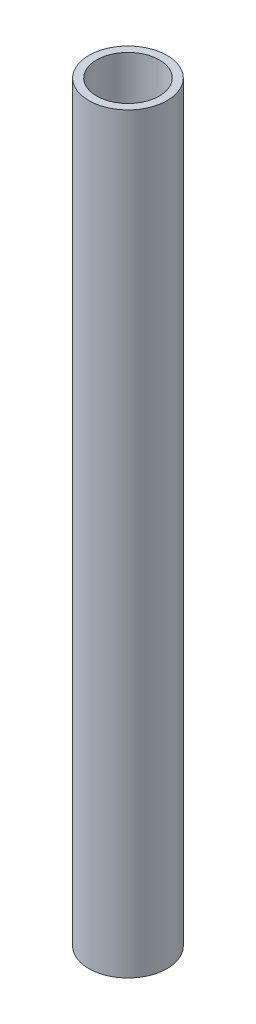
ISO-10303-21;
HEADER;
FILE_DESCRIPTION(('STEP AP214'),'2;1');
FILE_NAME('part.step','',(''),(''),'','','');
FILE_SCHEMA(('AUTOMOTIVE_DESIGN { 1 0 10303 214 1 1 1 1 }'));
ENDSEC;
DATA;
#1=APPLICATION_CONTEXT('core data for automotive mechanical design processes');
#2=APPLICATION_PROTOCOL_DEFINITION('international standard','automotive_design',2000,#1);
#3=PRODUCT_CONTEXT('',#1,'mechanical');
#4=PRODUCT('Part','Part','',(#3));
#5=PRODUCT_RELATED_PRODUCT_CATEGORY('part','',(#4));
#6=PRODUCT_DEFINITION_FORMATION('','',#4);
#7=PRODUCT_DEFINITION_CONTEXT('part definition',#1,'design');
#8=PRODUCT_DEFINITION('design','',#6,#7);
#9=PRODUCT_DEFINITION_SHAPE('','',#8);
#10=(LENGTH_UNIT() NAMED_UNIT(*) SI_UNIT(.MILLI.,.METRE.));
#11=(NAMED_UNIT(*) PLANE_ANGLE_UNIT() SI_UNIT($,.RADIAN.));
#12=(NAMED_UNIT(*) SI_UNIT($,.STERADIAN.) SOLID_ANGLE_UNIT());
#13=UNCERTAINTY_MEASURE_WITH_UNIT(LENGTH_MEASURE(1.E-05),#10,'distance_accuracy_value','');
#14=(GEOMETRIC_REPRESENTATION_CONTEXT(3) GLOBAL_UNCERTAINTY_ASSIGNED_CONTEXT((#13)) GLOBAL_UNIT_ASSIGNED_CONTEXT((#10,
#11,#12)) REPRESENTATION_CONTEXT('',''));
#15=CARTESIAN_POINT('',(0.,0.,0.));
#16=DIRECTION('',(0.,0.,1.));
#17=DIRECTION('',(1.,0.,0.));
#18=AXIS2_PLACEMENT_3D('',#15,#16,#17);
#19=CARTESIAN_POINT('',(0.,-152.4,0.));
#20=DIRECTION('',(0.,1.,0.));
#21=DIRECTION('',(0.,0.,1.));
#22=AXIS2_PLACEMENT_3D('',#19,#20,#21);
#23=CYLINDRICAL_SURFACE('',#22,15.875);
#24=CARTESIAN_POINT('',(0.,-152.4,0.));
#25=DIRECTION('',(0.,1.,0.));
#26=DIRECTION('',(0.,0.,1.));
#27=AXIS2_PLACEMENT_3D('',#24,#25,#26);
#28=CIRCLE('',#27,15.875);
#29=CARTESIAN_POINT('',(0.,-152.4,15.875));
#30=VERTEX_POINT('',#29);
#31=EDGE_CURVE('E10',#30,#30,#28,.T.);
#32=CARTESIAN_POINT('',(0.,152.4,0.));
#33=DIRECTION('',(0.,1.,0.));
#34=DIRECTION('',(0.,0.,1.));
#35=AXIS2_PLACEMENT_3D('',#32,#33,#34);
#36=CIRCLE('',#35,15.875);
#37=CARTESIAN_POINT('',(0.,152.4,15.875));
#38=VERTEX_POINT('',#37);
#39=EDGE_CURVE('E49',#38,#38,#36,.T.);
#40=CARTESIAN_POINT('',(0.,-152.4,15.875));
#41=CARTESIAN_POINT('',(0.,-149.225,15.875));
#42=CARTESIAN_POINT('',(0.,-146.05,15.875));
#43=CARTESIAN_POINT('',(0.,-139.7,15.875));
#44=CARTESIAN_POINT('',(0.,-136.525,15.875));
#45=CARTESIAN_POINT('',(0.,-130.175,15.875));
#46=CARTESIAN_POINT('',(0.,-127.,15.875));
#47=CARTESIAN_POINT('',(0.,-120.65,15.875));
#48=CARTESIAN_POINT('',(0.,-117.475,15.875));
#49=CARTESIAN_POINT('',(0.,-111.125,15.875));
#50=CARTESIAN_POINT('',(0.,-107.95,15.875));
#51=CARTESIAN_POINT('',(0.,-101.6,15.875));
#52=CARTESIAN_POINT('',(0.,-98.425,15.875));
#53=CARTESIAN_POINT('',(0.,-92.075,15.875));
#54=CARTESIAN_POINT('',(0.,-88.9,15.875));
#55=CARTESIAN_POINT('',(0.,-82.55,15.875));
#56=CARTESIAN_POINT('',(0.,-79.375,15.875));
#57=CARTESIAN_POINT('',(0.,-73.025,15.875));
#58=CARTESIAN_POINT('',(0.,-69.85,15.875));
#59=CARTESIAN_POINT('',(0.,-63.5,15.875));
#60=CARTESIAN_POINT('',(0.,-60.325,15.875));
#61=CARTESIAN_POINT('',(0.,-53.975,15.875));
#62=CARTESIAN_POINT('',(0.,-50.8,15.875));
#63=CARTESIAN_POINT('',(0.,-44.45,15.875));
#64=CARTESIAN_POINT('',(0.,-41.275,15.875));
#65=CARTESIAN_POINT('',(0.,-34.925,15.875));
#66=CARTESIAN_POINT('',(0.,-31.75,15.875));
#67=CARTESIAN_POINT('',(0.,-25.4,15.875));
#68=CARTESIAN_POINT('',(0.,-22.225,15.875));
#69=CARTESIAN_POINT('',(0.,-15.875,15.875));
#70=CARTESIAN_POINT('',(0.,-12.7,15.875));
#71=CARTESIAN_POINT('',(0.,-6.35000000000003,15.875));
#72=CARTESIAN_POINT('',(0.,-3.17500000000003,15.875));
#73=CARTESIAN_POINT('',(0.,3.17499999999997,15.875));
#74=CARTESIAN_POINT('',(0.,6.34999999999998,15.875));
#75=CARTESIAN_POINT('',(0.,12.7,15.875));
#76=CARTESIAN_POINT('',(0.,15.875,15.875));
#77=CARTESIAN_POINT('',(0.,22.225,15.875));
#78=CARTESIAN_POINT('',(0.,25.4,15.875));
#79=CARTESIAN_POINT('',(0.,31.75,15.875));
#80=CARTESIAN_POINT('',(0.,34.925,15.875));
#81=CARTESIAN_POINT('',(0.,41.275,15.875));
#82=CARTESIAN_POINT('',(0.,44.45,15.875));
#83=CARTESIAN_POINT('',(0.,50.8,15.875));
#84=CARTESIAN_POINT('',(0.,53.975,15.875));
#85=CARTESIAN_POINT('',(0.,60.325,15.875));
#86=CARTESIAN_POINT('',(0.,63.5,15.875));
#87=CARTESIAN_POINT('',(0.,69.85,15.875));
#88=CARTESIAN_POINT('',(0.,73.025,15.875));
#89=CARTESIAN_POINT('',(0.,79.375,15.875));
#90=CARTESIAN_POINT('',(0.,82.55,15.875));
#91=CARTESIAN_POINT('',(0.,88.9,15.875));
#92=CARTESIAN_POINT('',(0.,92.075,15.875));
#93=CARTESIAN_POINT('',(0.,98.425,15.875));
#94=CARTESIAN_POINT('',(0.,101.6,15.875));
#95=CARTESIAN_POINT('',(0.,107.95,15.875));
#96=CARTESIAN_POINT('',(0.,111.125,15.875));
#97=CARTESIAN_POINT('',(0.,117.475,15.875));
#98=CARTESIAN_POINT('',(0.,120.65,15.875));
#99=CARTESIAN_POINT('',(0.,127.,15.875));
#100=CARTESIAN_POINT('',(0.,130.175,15.875));
#101=CARTESIAN_POINT('',(0.,136.525,15.875));
#102=CARTESIAN_POINT('',(0.,139.7,15.875));
#103=CARTESIAN_POINT('',(0.,146.05,15.875));
#104=CARTESIAN_POINT('',(0.,149.225,15.875));
#105=CARTESIAN_POINT('',(0.,152.4,15.875));
#106=B_SPLINE_CURVE_WITH_KNOTS('',3,(#40,#41,#42,#43,#44,#45,#46,#47,#48,#49,#50,#51,#52,#53,
#54,#55,#56,#57,#58,#59,#60,#61,#62,#63,#64,#65,#66,#67,#68,#69,#70,#71,#72,#73,#74,#75,#76,#77,
#78,#79,#80,#81,#82,#83,#84,#85,#86,#87,#88,#89,#90,#91,#92,#93,#94,#95,#96,#97,#98,#99,#100,
#101,#102,#103,#104,#105),.UNSPECIFIED.,.F.,.F.,(4,2,2,2,2,2,2,2,2,2,2,2,2,2,2,2,2,2,2,2,2,2,2,
2,2,2,2,2,2,2,2,2,4),(0.,9.52500000000001,19.05,28.575,38.1,47.625,57.15,66.675,76.2,85.725,
95.25,104.775,114.3,123.825,133.35,142.875,152.4,161.925,171.45,180.975,190.5,200.025,209.55,
219.075,228.6,238.125,247.65,257.175,266.7,276.225,285.75,295.275,304.8),.UNSPECIFIED.);
#107=EDGE_CURVE('BSEAM39',#30,#38,#106,.T.);
#108=ORIENTED_EDGE('',*,*,#31,.T.);
#109=ORIENTED_EDGE('',*,*,#39,.F.);
#110=ORIENTED_EDGE('',*,*,#107,.T.);
#111=ORIENTED_EDGE('',*,*,#107,.F.);
#112=EDGE_LOOP('',(#108,#110,#109,#111));
#113=FACE_BOUND('',#112,.T.);
#114=ADVANCED_FACE('F39',(#113),#23,.T.);
#115=CARTESIAN_POINT('',(0.,-152.4,0.));
#116=DIRECTION('',(0.,1.,0.));
#117=DIRECTION('',(0.,0.,1.));
#118=AXIS2_PLACEMENT_3D('',#115,#116,#117);
#119=PLANE('',#118);
#120=CARTESIAN_POINT('',(0.,-152.4,0.));
#121=DIRECTION('',(0.,1.,0.));
#122=DIRECTION('',(0.,0.,1.));
#123=AXIS2_PLACEMENT_3D('',#120,#121,#122);
#124=CIRCLE('',#123,12.7);
#125=CARTESIAN_POINT('',(0.,-152.4,12.7));
#126=VERTEX_POINT('',#125);
#127=EDGE_CURVE('E45',#126,#126,#124,.T.);
#128=ORIENTED_EDGE('',*,*,#127,.T.);
#129=EDGE_LOOP('',(#128));
#130=FACE_BOUND('',#129,.T.);
#131=ORIENTED_EDGE('',*,*,#31,.F.);
#132=EDGE_LOOP('',(#131));
#133=FACE_BOUND('',#132,.T.);
#134=ADVANCED_FACE('F68',(#130,#133),#119,.F.);
#135=CARTESIAN_POINT('',(0.,-152.4,0.));
#136=DIRECTION('',(0.,1.,0.));
#137=DIRECTION('',(0.,0.,1.));
#138=AXIS2_PLACEMENT_3D('',#135,#136,#137);
#139=CYLINDRICAL_SURFACE('',#138,12.7);
#140=CARTESIAN_POINT('',(0.,152.4,0.));
#141=DIRECTION('',(0.,1.,0.));
#142=DIRECTION('',(0.,0.,1.));
#143=AXIS2_PLACEMENT_3D('',#140,#141,#142);
#144=CIRCLE('',#143,12.7);
#145=CARTESIAN_POINT('',(0.,152.4,12.7));
#146=VERTEX_POINT('',#145);
#147=EDGE_CURVE('E53',#146,#146,#144,.T.);
#148=CARTESIAN_POINT('',(0.,-152.4,12.7));
#149=CARTESIAN_POINT('',(0.,-149.225,12.7));
#150=CARTESIAN_POINT('',(0.,-146.05,12.7));
#151=CARTESIAN_POINT('',(0.,-139.7,12.7));
#152=CARTESIAN_POINT('',(0.,-136.525,12.7));
#153=CARTESIAN_POINT('',(0.,-130.175,12.7));
#154=CARTESIAN_POINT('',(0.,-127.,12.7));
#155=CARTESIAN_POINT('',(0.,-120.65,12.7));
#156=CARTESIAN_POINT('',(0.,-117.475,12.7));
#157=CARTESIAN_POINT('',(0.,-111.125,12.7));
#158=CARTESIAN_POINT('',(0.,-107.95,12.7));
#159=CARTESIAN_POINT('',(0.,-101.6,12.7));
#160=CARTESIAN_POINT('',(0.,-98.425,12.7));
#161=CARTESIAN_POINT('',(0.,-92.075,12.7));
#162=CARTESIAN_POINT('',(0.,-88.9,12.7));
#163=CARTESIAN_POINT('',(0.,-82.55,12.7));
#164=CARTESIAN_POINT('',(0.,-79.375,12.7));
#165=CARTESIAN_POINT('',(0.,-73.025,12.7));
#166=CARTESIAN_POINT('',(0.,-69.85,12.7));
#167=CARTESIAN_POINT('',(0.,-63.5,12.7));
#168=CARTESIAN_POINT('',(0.,-60.325,12.7));
#169=CARTESIAN_POINT('',(0.,-53.975,12.7));
#170=CARTESIAN_POINT('',(0.,-50.8,12.7));
#171=CARTESIAN_POINT('',(0.,-44.45,12.7));
#172=CARTESIAN_POINT('',(0.,-41.275,12.7));
#173=CARTESIAN_POINT('',(0.,-34.925,12.7));
#174=CARTESIAN_POINT('',(0.,-31.75,12.7));
#175=CARTESIAN_POINT('',(0.,-25.4,12.7));
#176=CARTESIAN_POINT('',(0.,-22.225,12.7));
#177=CARTESIAN_POINT('',(0.,-15.875,12.7));
#178=CARTESIAN_POINT('',(0.,-12.7,12.7));
#179=CARTESIAN_POINT('',(0.,-6.35000000000003,12.7));
#180=CARTESIAN_POINT('',(0.,-3.17500000000003,12.7));
#181=CARTESIAN_POINT('',(0.,3.17499999999997,12.7));
#182=CARTESIAN_POINT('',(0.,6.34999999999998,12.7));
#183=CARTESIAN_POINT('',(0.,12.7,12.7));
#184=CARTESIAN_POINT('',(0.,15.875,12.7));
#185=CARTESIAN_POINT('',(0.,22.225,12.7));
#186=CARTESIAN_POINT('',(0.,25.4,12.7));
#187=CARTESIAN_POINT('',(0.,31.75,12.7));
#188=CARTESIAN_POINT('',(0.,34.925,12.7));
#189=CARTESIAN_POINT('',(0.,41.275,12.7));
#190=CARTESIAN_POINT('',(0.,44.45,12.7));
#191=CARTESIAN_POINT('',(0.,50.8,12.7));
#192=CARTESIAN_POINT('',(0.,53.975,12.7));
#193=CARTESIAN_POINT('',(0.,60.325,12.7));
#194=CARTESIAN_POINT('',(0.,63.5,12.7));
#195=CARTESIAN_POINT('',(0.,69.85,12.7));
#196=CARTESIAN_POINT('',(0.,73.025,12.7));
#197=CARTESIAN_POINT('',(0.,79.375,12.7));
#198=CARTESIAN_POINT('',(0.,82.55,12.7));
#199=CARTESIAN_POINT('',(0.,88.9,12.7));
#200=CARTESIAN_POINT('',(0.,92.075,12.7));
#201=CARTESIAN_POINT('',(0.,98.425,12.7));
#202=CARTESIAN_POINT('',(0.,101.6,12.7));
#203=CARTESIAN_POINT('',(0.,107.95,12.7));
#204=CARTESIAN_POINT('',(0.,111.125,12.7));
#205=CARTESIAN_POINT('',(0.,117.475,12.7));
#206=CARTESIAN_POINT('',(0.,120.65,12.7));
#207=CARTESIAN_POINT('',(0.,127.,12.7));
#208=CARTESIAN_POINT('',(0.,130.175,12.7));
#209=CARTESIAN_POINT('',(0.,136.525,12.7));
#210=CARTESIAN_POINT('',(0.,139.7,12.7));
#211=CARTESIAN_POINT('',(0.,146.05,12.7));
#212=CARTESIAN_POINT('',(0.,149.225,12.7));
#213=CARTESIAN_POINT('',(0.,152.4,12.7));
#214=B_SPLINE_CURVE_WITH_KNOTS('',3,(#148,#149,#150,#151,#152,#153,#154,#155,#156,#157,#158,
#159,#160,#161,#162,#163,#164,#165,#166,#167,#168,#169,#170,#171,#172,#173,#174,#175,#176,#177,
#178,#179,#180,#181,#182,#183,#184,#185,#186,#187,#188,#189,#190,#191,#192,#193,#194,#195,#196,
#197,#198,#199,#200,#201,#202,#203,#204,#205,#206,#207,#208,#209,#210,#211,#212,#213),
.UNSPECIFIED.,.F.,.F.,(4,2,2,2,2,2,2,2,2,2,2,2,2,2,2,2,2,2,2,2,2,2,2,2,2,2,2,2,2,2,2,2,4),(0.,
9.52500000000001,19.05,28.575,38.1,47.625,57.15,66.675,76.2,85.725,95.25,104.775,114.3,123.825,
133.35,142.875,152.4,161.925,171.45,180.975,190.5,200.025,209.55,219.075,228.6,238.125,247.65,
257.175,266.7,276.225,285.75,295.275,304.8),.UNSPECIFIED.);
#215=EDGE_CURVE('BSEAM59',#126,#146,#214,.T.);
#216=ORIENTED_EDGE('',*,*,#127,.F.);
#217=ORIENTED_EDGE('',*,*,#147,.T.);
#218=ORIENTED_EDGE('',*,*,#215,.T.);
#219=ORIENTED_EDGE('',*,*,#215,.F.);
#220=EDGE_LOOP('',(#216,#218,#217,#219));
#221=FACE_BOUND('',#220,.T.);
#222=ADVANCED_FACE('F59',(#221),#139,.F.);
#223=CARTESIAN_POINT('',(0.,152.4,0.));
#224=DIRECTION('',(0.,1.,0.));
#225=DIRECTION('',(0.,0.,1.));
#226=AXIS2_PLACEMENT_3D('',#223,#224,#225);
#227=PLANE('',#226);
#228=ORIENTED_EDGE('',*,*,#39,.T.);
#229=EDGE_LOOP('',(#228));
#230=FACE_BOUND('',#229,.T.);
#231=ORIENTED_EDGE('',*,*,#147,.F.);
#232=EDGE_LOOP('',(#231));
#233=FACE_BOUND('',#232,.T.);
#234=ADVANCED_FACE('F61',(#230,#233),#227,.T.);
#235=CLOSED_SHELL('',(#114,#134,#222,#234));
#236=MANIFOLD_SOLID_BREP('B2',#235);
#237=ADVANCED_BREP_SHAPE_REPRESENTATION('',(#18,#236),#14);
#238=SHAPE_DEFINITION_REPRESENTATION(#9,#237);
ENDSEC;
END-ISO-10303-21;
